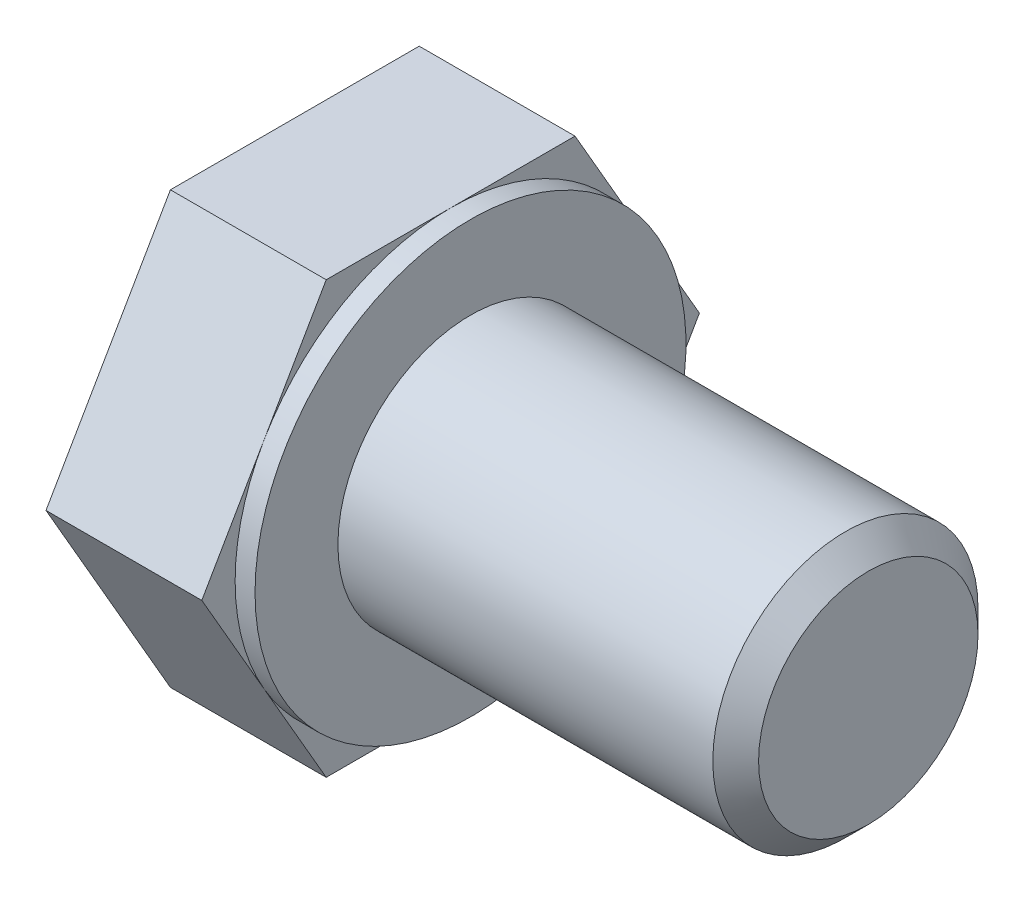
ISO-10303-21;
HEADER;
FILE_DESCRIPTION(('STEP AP214'),'2;1');
FILE_NAME('part.step','',(''),(''),'','','');
FILE_SCHEMA(('AUTOMOTIVE_DESIGN { 1 0 10303 214 1 1 1 1 }'));
ENDSEC;
DATA;
#1=APPLICATION_CONTEXT('core data for automotive mechanical design processes');
#2=APPLICATION_PROTOCOL_DEFINITION('international standard','automotive_design',2000,#1);
#3=PRODUCT_CONTEXT('',#1,'mechanical');
#4=PRODUCT('Part','Part','',(#3));
#5=PRODUCT_RELATED_PRODUCT_CATEGORY('part','',(#4));
#6=PRODUCT_DEFINITION_FORMATION('','',#4);
#7=PRODUCT_DEFINITION_CONTEXT('part definition',#1,'design');
#8=PRODUCT_DEFINITION('design','',#6,#7);
#9=PRODUCT_DEFINITION_SHAPE('','',#8);
#10=(LENGTH_UNIT() NAMED_UNIT(*) SI_UNIT(.MILLI.,.METRE.));
#11=(NAMED_UNIT(*) PLANE_ANGLE_UNIT() SI_UNIT($,.RADIAN.));
#12=(NAMED_UNIT(*) SI_UNIT($,.STERADIAN.) SOLID_ANGLE_UNIT());
#13=UNCERTAINTY_MEASURE_WITH_UNIT(LENGTH_MEASURE(1.E-05),#10,'distance_accuracy_value','');
#14=(GEOMETRIC_REPRESENTATION_CONTEXT(3) GLOBAL_UNCERTAINTY_ASSIGNED_CONTEXT((#13)) GLOBAL_UNIT_ASSIGNED_CONTEXT((#10,
#11,#12)) REPRESENTATION_CONTEXT('',''));
#15=CARTESIAN_POINT('',(0.,0.,0.));
#16=DIRECTION('',(0.,0.,1.));
#17=DIRECTION('',(1.,0.,0.));
#18=AXIS2_PLACEMENT_3D('',#15,#16,#17);
#19=CARTESIAN_POINT('',(0.,0.,0.));
#20=DIRECTION('',(-1.,0.,0.));
#21=DIRECTION('',(0.,0.,1.));
#22=AXIS2_PLACEMENT_3D('',#19,#20,#21);
#23=CYLINDRICAL_SURFACE('',#22,4.);
#24=CARTESIAN_POINT('',(0.,0.,0.));
#25=DIRECTION('',(-1.,0.,0.));
#26=DIRECTION('',(0.,0.,1.));
#27=AXIS2_PLACEMENT_3D('',#24,#25,#26);
#28=CIRCLE('',#27,4.);
#29=CARTESIAN_POINT('',(0.,0.,4.));
#30=VERTEX_POINT('',#29);
#31=EDGE_CURVE('E11',#30,#30,#28,.T.);
#32=ORIENTED_EDGE('',*,*,#31,.F.);
#33=EDGE_LOOP('',(#32));
#34=FACE_BOUND('',#33,.T.);
#35=CARTESIAN_POINT('',(11.3095,0.,0.));
#36=DIRECTION('',(-1.,0.,0.));
#37=DIRECTION('',(0.,0.,1.));
#38=AXIS2_PLACEMENT_3D('',#35,#36,#37);
#39=CIRCLE('',#38,4.);
#40=CARTESIAN_POINT('',(11.3095,0.,4.));
#41=VERTEX_POINT('',#40);
#42=EDGE_CURVE('E129',#41,#41,#39,.T.);
#43=ORIENTED_EDGE('',*,*,#42,.T.);
#44=EDGE_LOOP('',(#43));
#45=FACE_BOUND('',#44,.T.);
#46=ADVANCED_FACE('F34',(#34,#45),#23,.T.);
#47=CARTESIAN_POINT('',(0.,0.,-4.));
#48=DIRECTION('',(-1.,0.,0.));
#49=DIRECTION('',(0.,0.,1.));
#50=AXIS2_PLACEMENT_3D('',#47,#48,#49);
#51=PLANE('',#50);
#52=CARTESIAN_POINT('',(0.,0.,0.));
#53=DIRECTION('',(-1.,0.,0.));
#54=DIRECTION('',(0.,0.,1.));
#55=AXIS2_PLACEMENT_3D('',#52,#53,#54);
#56=CIRCLE('',#55,6.5);
#57=CARTESIAN_POINT('',(0.,0.,6.5));
#58=VERTEX_POINT('',#57);
#59=EDGE_CURVE('E41',#58,#58,#56,.T.);
#60=ORIENTED_EDGE('',*,*,#59,.F.);
#61=EDGE_LOOP('',(#60));
#62=FACE_BOUND('',#61,.T.);
#63=ORIENTED_EDGE('',*,*,#31,.T.);
#64=EDGE_LOOP('',(#63));
#65=FACE_BOUND('',#64,.T.);
#66=ADVANCED_FACE('F148',(#62,#65),#51,.F.);
#67=CARTESIAN_POINT('',(0.,0.,0.));
#68=DIRECTION('',(-1.,0.,0.));
#69=DIRECTION('',(0.,0.,1.));
#70=AXIS2_PLACEMENT_3D('',#67,#68,#69);
#71=CYLINDRICAL_SURFACE('',#70,6.5);
#72=CARTESIAN_POINT('',(-0.6,0.,0.));
#73=DIRECTION('',(-1.,0.,0.));
#74=DIRECTION('',(0.,0.,1.));
#75=AXIS2_PLACEMENT_3D('',#72,#73,#74);
#76=CIRCLE('',#75,6.5);
#77=CARTESIAN_POINT('',(-0.6,3.25,5.62916512459885));
#78=VERTEX_POINT('',#77);
#79=CARTESIAN_POINT('',(-0.6,6.5,0.));
#80=VERTEX_POINT('',#79);
#81=EDGE_CURVE('E140',#78,#80,#76,.T.);
#82=ORIENTED_EDGE('',*,*,#81,.F.);
#83=CARTESIAN_POINT('',(-0.6,-3.25,5.62916512459886));
#84=VERTEX_POINT('',#83);
#85=EDGE_CURVE('E48',#84,#78,#76,.T.);
#86=ORIENTED_EDGE('',*,*,#85,.F.);
#87=CARTESIAN_POINT('',(-0.6,-6.5,0.));
#88=VERTEX_POINT('',#87);
#89=EDGE_CURVE('E52',#88,#84,#76,.T.);
#90=ORIENTED_EDGE('',*,*,#89,.F.);
#91=CARTESIAN_POINT('',(-0.6,-3.25,-5.62916512459885));
#92=VERTEX_POINT('',#91);
#93=EDGE_CURVE('E377',#92,#88,#76,.T.);
#94=ORIENTED_EDGE('',*,*,#93,.F.);
#95=CARTESIAN_POINT('',(-0.6,3.25,-5.62916512459886));
#96=VERTEX_POINT('',#95);
#97=EDGE_CURVE('E376',#96,#92,#76,.T.);
#98=ORIENTED_EDGE('',*,*,#97,.F.);
#99=EDGE_CURVE('E142',#80,#96,#76,.T.);
#100=ORIENTED_EDGE('',*,*,#99,.F.);
#101=EDGE_LOOP('',(#82,#86,#90,#94,#98,#100));
#102=FACE_BOUND('',#101,.T.);
#103=ORIENTED_EDGE('',*,*,#59,.T.);
#104=EDGE_LOOP('',(#103));
#105=FACE_BOUND('',#104,.T.);
#106=ADVANCED_FACE('F146',(#102,#105),#71,.T.);
#107=CARTESIAN_POINT('',(12.,0.,0.));
#108=DIRECTION('',(-1.,0.,0.));
#109=DIRECTION('',(0.,0.,1.));
#110=AXIS2_PLACEMENT_3D('',#107,#108,#109);
#111=PLANE('',#110);
#112=CARTESIAN_POINT('',(12.,0.,0.));
#113=DIRECTION('',(-1.,0.,0.));
#114=DIRECTION('',(0.,0.,1.));
#115=AXIS2_PLACEMENT_3D('',#112,#113,#114);
#116=CIRCLE('',#115,3.3095);
#117=CARTESIAN_POINT('',(12.,0.,3.3095));
#118=VERTEX_POINT('',#117);
#119=EDGE_CURVE('E132',#118,#118,#116,.T.);
#120=ORIENTED_EDGE('',*,*,#119,.F.);
#121=EDGE_LOOP('',(#120));
#122=FACE_BOUND('',#121,.T.);
#123=ADVANCED_FACE('F161',(#122),#111,.F.);
#124=CARTESIAN_POINT('',(12.,0.,0.));
#125=DIRECTION('',(-1.,0.,0.));
#126=DIRECTION('',(0.,0.,1.));
#127=AXIS2_PLACEMENT_3D('',#124,#125,#126);
#128=CONICAL_SURFACE('',#127,3.3095,0.785398163397453);
#129=ORIENTED_EDGE('',*,*,#42,.F.);
#130=EDGE_LOOP('',(#129));
#131=FACE_BOUND('',#130,.T.);
#132=ORIENTED_EDGE('',*,*,#119,.T.);
#133=EDGE_LOOP('',(#132));
#134=FACE_BOUND('',#133,.T.);
#135=ADVANCED_FACE('F157',(#131,#134),#128,.T.);
#136=CARTESIAN_POINT('',(-0.6,0.,7.50555349946513));
#137=DIRECTION('',(-1.,0.,0.));
#138=DIRECTION('',(0.,0.,1.));
#139=AXIS2_PLACEMENT_3D('',#136,#137,#138);
#140=PLANE('',#139);
#141=DIRECTION('',(0.,0.866025403784438,-0.500000000000001));
#142=VECTOR('',#141,1.);
#143=CARTESIAN_POINT('',(-0.6,0.,7.50555349946513));
#144=LINE('',#143,#142);
#145=CARTESIAN_POINT('',(-0.6,6.5,3.75277674973256));
#146=VERTEX_POINT('',#145);
#147=EDGE_CURVE('E373',#78,#146,#144,.T.);
#148=ORIENTED_EDGE('',*,*,#147,.F.);
#149=ORIENTED_EDGE('',*,*,#81,.T.);
#150=DIRECTION('',(0.,0.,-1.));
#151=VECTOR('',#150,1.);
#152=CARTESIAN_POINT('',(-0.6,6.5,3.75277674973256));
#153=LINE('',#152,#151);
#154=EDGE_CURVE('E340',#146,#80,#153,.T.);
#155=ORIENTED_EDGE('',*,*,#154,.F.);
#156=EDGE_LOOP('',(#148,#149,#155));
#157=FACE_BOUND('',#156,.T.);
#158=ADVANCED_FACE('F160',(#157),#140,.F.);
#159=CARTESIAN_POINT('',(-0.6,6.5,-3.75277674973257));
#160=VERTEX_POINT('',#159);
#161=EDGE_CURVE('E333',#80,#160,#153,.T.);
#162=ORIENTED_EDGE('',*,*,#161,.F.);
#163=ORIENTED_EDGE('',*,*,#99,.T.);
#164=DIRECTION('',(0.,-0.866025403784439,-0.5));
#165=VECTOR('',#164,1.);
#166=CARTESIAN_POINT('',(-0.6,6.5,-3.75277674973257));
#167=LINE('',#166,#165);
#168=EDGE_CURVE('E337',#160,#96,#167,.T.);
#169=ORIENTED_EDGE('',*,*,#168,.F.);
#170=EDGE_LOOP('',(#162,#163,#169));
#171=FACE_BOUND('',#170,.T.);
#172=ADVANCED_FACE('F195',(#171),#140,.F.);
#173=CARTESIAN_POINT('',(-0.6,0.,-7.50555349946514));
#174=VERTEX_POINT('',#173);
#175=EDGE_CURVE('E345',#96,#174,#167,.T.);
#176=ORIENTED_EDGE('',*,*,#175,.F.);
#177=ORIENTED_EDGE('',*,*,#97,.T.);
#178=DIRECTION('',(0.,-0.866025403784438,0.5));
#179=VECTOR('',#178,1.);
#180=CARTESIAN_POINT('',(-0.6,0.,-7.50555349946514));
#181=LINE('',#180,#179);
#182=EDGE_CURVE('E351',#174,#92,#181,.T.);
#183=ORIENTED_EDGE('',*,*,#182,.F.);
#184=EDGE_LOOP('',(#176,#177,#183));
#185=FACE_BOUND('',#184,.T.);
#186=ADVANCED_FACE('F244',(#185),#140,.F.);
#187=CARTESIAN_POINT('',(-0.6,-6.5,-3.75277674973257));
#188=VERTEX_POINT('',#187);
#189=EDGE_CURVE('E350',#92,#188,#181,.T.);
#190=ORIENTED_EDGE('',*,*,#189,.F.);
#191=ORIENTED_EDGE('',*,*,#93,.T.);
#192=DIRECTION('',(0.,0.,1.));
#193=VECTOR('',#192,1.);
#194=CARTESIAN_POINT('',(-0.6,-6.5,-3.75277674973257));
#195=LINE('',#194,#193);
#196=EDGE_CURVE('E122',#188,#88,#195,.T.);
#197=ORIENTED_EDGE('',*,*,#196,.F.);
#198=EDGE_LOOP('',(#190,#191,#197));
#199=FACE_BOUND('',#198,.T.);
#200=ADVANCED_FACE('F237',(#199),#140,.F.);
#201=CARTESIAN_POINT('',(-0.6,-6.5,3.75277674973257));
#202=VERTEX_POINT('',#201);
#203=EDGE_CURVE('E354',#88,#202,#195,.T.);
#204=ORIENTED_EDGE('',*,*,#203,.F.);
#205=ORIENTED_EDGE('',*,*,#89,.T.);
#206=DIRECTION('',(0.,0.866025403784439,0.499999999999999));
#207=VECTOR('',#206,1.);
#208=CARTESIAN_POINT('',(-0.6,-6.5,3.75277674973257));
#209=LINE('',#208,#207);
#210=EDGE_CURVE('E372',#202,#84,#209,.T.);
#211=ORIENTED_EDGE('',*,*,#210,.F.);
#212=EDGE_LOOP('',(#204,#205,#211));
#213=FACE_BOUND('',#212,.T.);
#214=ADVANCED_FACE('F230',(#213),#140,.F.);
#215=CARTESIAN_POINT('',(-0.6,0.,7.50555349946513));
#216=VERTEX_POINT('',#215);
#217=EDGE_CURVE('E127',#84,#216,#209,.T.);
#218=ORIENTED_EDGE('',*,*,#217,.F.);
#219=ORIENTED_EDGE('',*,*,#85,.T.);
#220=EDGE_CURVE('E341',#216,#78,#144,.T.);
#221=ORIENTED_EDGE('',*,*,#220,.F.);
#222=EDGE_LOOP('',(#218,#219,#221));
#223=FACE_BOUND('',#222,.T.);
#224=ADVANCED_FACE('F174',(#223),#140,.F.);
#225=CARTESIAN_POINT('',(-5.3,-6.5,3.75277674973257));
#226=DIRECTION('',(0.,0.499999999999999,-0.866025403784439));
#227=DIRECTION('',(0.,0.866025403784439,0.499999999999999));
#228=AXIS2_PLACEMENT_3D('',#225,#226,#227);
#229=PLANE('',#228);
#230=ORIENTED_EDGE('',*,*,#210,.T.);
#231=ORIENTED_EDGE('',*,*,#217,.T.);
#232=DIRECTION('',(1.,0.,0.));
#233=VECTOR('',#232,1.);
#234=CARTESIAN_POINT('',(-5.3,0.,7.50555349946513));
#235=LINE('',#234,#233);
#236=CARTESIAN_POINT('',(-5.3,0.,7.50555349946513));
#237=VERTEX_POINT('',#236);
#238=EDGE_CURVE('E107',#237,#216,#235,.T.);
#239=ORIENTED_EDGE('',*,*,#238,.F.);
#240=DIRECTION('',(0.,0.866025403784439,0.499999999999999));
#241=VECTOR('',#240,1.);
#242=CARTESIAN_POINT('',(-5.3,-6.5,3.75277674973257));
#243=LINE('',#242,#241);
#244=CARTESIAN_POINT('',(-5.3,-6.5,3.75277674973257));
#245=VERTEX_POINT('',#244);
#246=EDGE_CURVE('E113',#245,#237,#243,.T.);
#247=ORIENTED_EDGE('',*,*,#246,.F.);
#248=DIRECTION('',(1.,0.,0.));
#249=VECTOR('',#248,1.);
#250=CARTESIAN_POINT('',(-5.3,-6.5,3.75277674973257));
#251=LINE('',#250,#249);
#252=EDGE_CURVE('E357',#245,#202,#251,.T.);
#253=ORIENTED_EDGE('',*,*,#252,.T.);
#254=EDGE_LOOP('',(#230,#231,#239,#247,#253));
#255=FACE_BOUND('',#254,.T.);
#256=ADVANCED_FACE('F125',(#255),#229,.F.);
#257=CARTESIAN_POINT('',(-5.3,0.,7.50555349946513));
#258=DIRECTION('',(0.,-0.5,-0.866025403784438));
#259=DIRECTION('',(0.,0.866025403784438,-0.5));
#260=AXIS2_PLACEMENT_3D('',#257,#258,#259);
#261=PLANE('',#260);
#262=ORIENTED_EDGE('',*,*,#220,.T.);
#263=ORIENTED_EDGE('',*,*,#147,.T.);
#264=DIRECTION('',(1.,0.,0.));
#265=VECTOR('',#264,1.);
#266=CARTESIAN_POINT('',(-5.3,6.5,3.75277674973256));
#267=LINE('',#266,#265);
#268=CARTESIAN_POINT('',(-5.3,6.5,3.75277674973256));
#269=VERTEX_POINT('',#268);
#270=EDGE_CURVE('E109',#269,#146,#267,.T.);
#271=ORIENTED_EDGE('',*,*,#270,.F.);
#272=DIRECTION('',(0.,0.866025403784438,-0.500000000000001));
#273=VECTOR('',#272,1.);
#274=CARTESIAN_POINT('',(-5.3,0.,7.50555349946513));
#275=LINE('',#274,#273);
#276=EDGE_CURVE('E102',#237,#269,#275,.T.);
#277=ORIENTED_EDGE('',*,*,#276,.F.);
#278=ORIENTED_EDGE('',*,*,#238,.T.);
#279=EDGE_LOOP('',(#262,#263,#271,#277,#278));
#280=FACE_BOUND('',#279,.T.);
#281=ADVANCED_FACE('F105',(#280),#261,.F.);
#282=CARTESIAN_POINT('',(-5.3,6.5,3.75277674973256));
#283=DIRECTION('',(0.,-1.,0.));
#284=DIRECTION('',(0.,0.,-1.));
#285=AXIS2_PLACEMENT_3D('',#282,#283,#284);
#286=PLANE('',#285);
#287=ORIENTED_EDGE('',*,*,#154,.T.);
#288=ORIENTED_EDGE('',*,*,#161,.T.);
#289=DIRECTION('',(1.,0.,0.));
#290=VECTOR('',#289,1.);
#291=CARTESIAN_POINT('',(-5.3,6.5,-3.75277674973257));
#292=LINE('',#291,#290);
#293=CARTESIAN_POINT('',(-5.3,6.5,-3.75277674973257));
#294=VERTEX_POINT('',#293);
#295=EDGE_CURVE('E134',#294,#160,#292,.T.);
#296=ORIENTED_EDGE('',*,*,#295,.F.);
#297=DIRECTION('',(0.,0.,-1.));
#298=VECTOR('',#297,1.);
#299=CARTESIAN_POINT('',(-5.3,6.5,3.75277674973256));
#300=LINE('',#299,#298);
#301=EDGE_CURVE('E112',#269,#294,#300,.T.);
#302=ORIENTED_EDGE('',*,*,#301,.F.);
#303=ORIENTED_EDGE('',*,*,#270,.T.);
#304=EDGE_LOOP('',(#287,#288,#296,#302,#303));
#305=FACE_BOUND('',#304,.T.);
#306=ADVANCED_FACE('F177',(#305),#286,.F.);
#307=CARTESIAN_POINT('',(-5.3,6.5,-3.75277674973257));
#308=DIRECTION('',(0.,-0.499999999999999,0.866025403784439));
#309=DIRECTION('',(0.,-0.866025403784439,-0.5));
#310=AXIS2_PLACEMENT_3D('',#307,#308,#309);
#311=PLANE('',#310);
#312=ORIENTED_EDGE('',*,*,#168,.T.);
#313=ORIENTED_EDGE('',*,*,#175,.T.);
#314=DIRECTION('',(1.,0.,0.));
#315=VECTOR('',#314,1.);
#316=CARTESIAN_POINT('',(-5.3,0.,-7.50555349946514));
#317=LINE('',#316,#315);
#318=CARTESIAN_POINT('',(-5.3,0.,-7.50555349946514));
#319=VERTEX_POINT('',#318);
#320=EDGE_CURVE('E362',#319,#174,#317,.T.);
#321=ORIENTED_EDGE('',*,*,#320,.F.);
#322=DIRECTION('',(0.,-0.866025403784439,-0.5));
#323=VECTOR('',#322,1.);
#324=CARTESIAN_POINT('',(-5.3,6.5,-3.75277674973257));
#325=LINE('',#324,#323);
#326=EDGE_CURVE('E366',#294,#319,#325,.T.);
#327=ORIENTED_EDGE('',*,*,#326,.F.);
#328=ORIENTED_EDGE('',*,*,#295,.T.);
#329=EDGE_LOOP('',(#312,#313,#321,#327,#328));
#330=FACE_BOUND('',#329,.T.);
#331=ADVANCED_FACE('F180',(#330),#311,.F.);
#332=CARTESIAN_POINT('',(-5.3,0.,-7.50555349946514));
#333=DIRECTION('',(0.,0.5,0.866025403784438));
#334=DIRECTION('',(0.,-0.866025403784438,0.5));
#335=AXIS2_PLACEMENT_3D('',#332,#333,#334);
#336=PLANE('',#335);
#337=ORIENTED_EDGE('',*,*,#182,.T.);
#338=ORIENTED_EDGE('',*,*,#189,.T.);
#339=DIRECTION('',(1.,0.,0.));
#340=VECTOR('',#339,1.);
#341=CARTESIAN_POINT('',(-5.3,-6.5,-3.75277674973257));
#342=LINE('',#341,#340);
#343=CARTESIAN_POINT('',(-5.3,-6.5,-3.75277674973257));
#344=VERTEX_POINT('',#343);
#345=EDGE_CURVE('E359',#344,#188,#342,.T.);
#346=ORIENTED_EDGE('',*,*,#345,.F.);
#347=DIRECTION('',(0.,-0.866025403784438,0.5));
#348=VECTOR('',#347,1.);
#349=CARTESIAN_POINT('',(-5.3,0.,-7.50555349946514));
#350=LINE('',#349,#348);
#351=EDGE_CURVE('E368',#319,#344,#350,.T.);
#352=ORIENTED_EDGE('',*,*,#351,.F.);
#353=ORIENTED_EDGE('',*,*,#320,.T.);
#354=EDGE_LOOP('',(#337,#338,#346,#352,#353));
#355=FACE_BOUND('',#354,.T.);
#356=ADVANCED_FACE('F184',(#355),#336,.F.);
#357=CARTESIAN_POINT('',(-5.3,-6.5,-3.75277674973257));
#358=DIRECTION('',(0.,1.,0.));
#359=DIRECTION('',(0.,0.,1.));
#360=AXIS2_PLACEMENT_3D('',#357,#358,#359);
#361=PLANE('',#360);
#362=ORIENTED_EDGE('',*,*,#196,.T.);
#363=ORIENTED_EDGE('',*,*,#203,.T.);
#364=ORIENTED_EDGE('',*,*,#252,.F.);
#365=DIRECTION('',(0.,0.,1.));
#366=VECTOR('',#365,1.);
#367=CARTESIAN_POINT('',(-5.3,-6.5,-3.75277674973257));
#368=LINE('',#367,#366);
#369=EDGE_CURVE('E118',#344,#245,#368,.T.);
#370=ORIENTED_EDGE('',*,*,#369,.F.);
#371=ORIENTED_EDGE('',*,*,#345,.T.);
#372=EDGE_LOOP('',(#362,#363,#364,#370,#371));
#373=FACE_BOUND('',#372,.T.);
#374=ADVANCED_FACE('F188',(#373),#361,.F.);
#375=CARTESIAN_POINT('',(-5.3,0.,7.50555349946513));
#376=DIRECTION('',(-1.,0.,0.));
#377=DIRECTION('',(0.,0.,1.));
#378=AXIS2_PLACEMENT_3D('',#375,#376,#377);
#379=PLANE('',#378);
#380=ORIENTED_EDGE('',*,*,#246,.T.);
#381=ORIENTED_EDGE('',*,*,#276,.T.);
#382=ORIENTED_EDGE('',*,*,#301,.T.);
#383=ORIENTED_EDGE('',*,*,#326,.T.);
#384=ORIENTED_EDGE('',*,*,#351,.T.);
#385=ORIENTED_EDGE('',*,*,#369,.T.);
#386=EDGE_LOOP('',(#380,#381,#382,#383,#384,#385));
#387=FACE_BOUND('',#386,.T.);
#388=ADVANCED_FACE('F116',(#387),#379,.T.);
#389=CLOSED_SHELL('',(#46,#66,#106,#123,#135,#158,#172,#186,#200,#214,#224,#256,#281,#306,#331,
#356,#374,#388));
#390=MANIFOLD_SOLID_BREP('B2',#389);
#391=ADVANCED_BREP_SHAPE_REPRESENTATION('',(#18,#390),#14);
#392=SHAPE_DEFINITION_REPRESENTATION(#9,#391);
ENDSEC;
END-ISO-10303-21;
